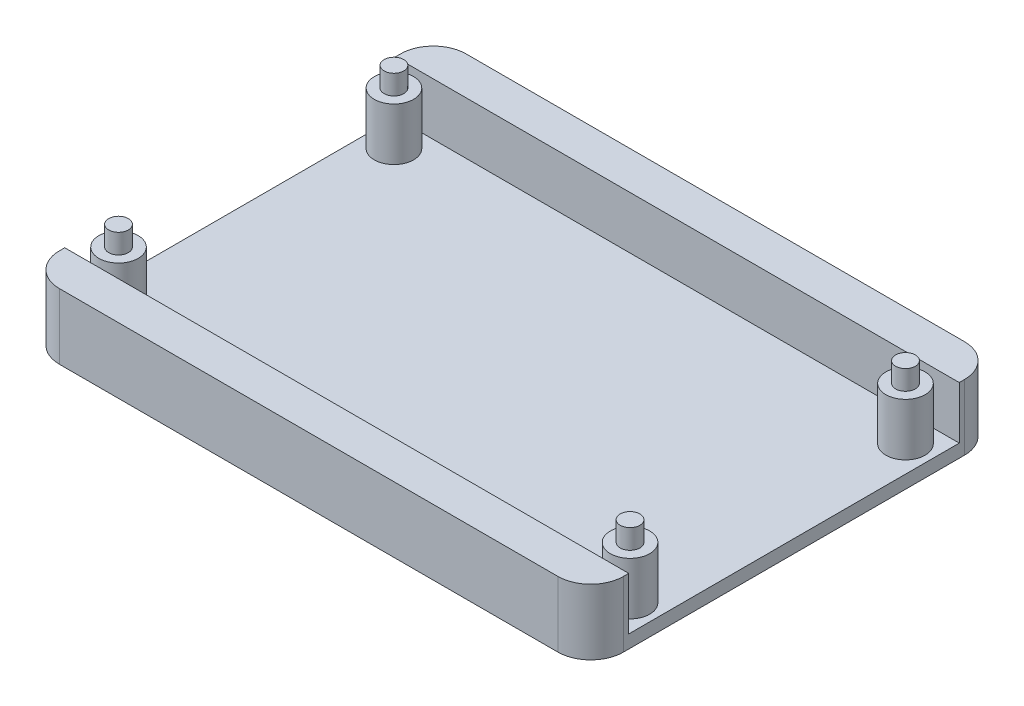
ISO-10303-21;
HEADER;
FILE_DESCRIPTION(('STEP AP214'),'2;1');
FILE_NAME('part.step','',(''),(''),'','','');
FILE_SCHEMA(('AUTOMOTIVE_DESIGN { 1 0 10303 214 1 1 1 1 }'));
ENDSEC;
DATA;
#1=APPLICATION_CONTEXT('core data for automotive mechanical design processes');
#2=APPLICATION_PROTOCOL_DEFINITION('international standard','automotive_design',2000,#1);
#3=PRODUCT_CONTEXT('',#1,'mechanical');
#4=PRODUCT('Part','Part','',(#3));
#5=PRODUCT_RELATED_PRODUCT_CATEGORY('part','',(#4));
#6=PRODUCT_DEFINITION_FORMATION('','',#4);
#7=PRODUCT_DEFINITION_CONTEXT('part definition',#1,'design');
#8=PRODUCT_DEFINITION('design','',#6,#7);
#9=PRODUCT_DEFINITION_SHAPE('','',#8);
#10=(LENGTH_UNIT() NAMED_UNIT(*) SI_UNIT(.MILLI.,.METRE.));
#11=(NAMED_UNIT(*) PLANE_ANGLE_UNIT() SI_UNIT($,.RADIAN.));
#12=(NAMED_UNIT(*) SI_UNIT($,.STERADIAN.) SOLID_ANGLE_UNIT());
#13=UNCERTAINTY_MEASURE_WITH_UNIT(LENGTH_MEASURE(1.E-05),#10,'distance_accuracy_value','');
#14=(GEOMETRIC_REPRESENTATION_CONTEXT(3) GLOBAL_UNCERTAINTY_ASSIGNED_CONTEXT((#13)) GLOBAL_UNIT_ASSIGNED_CONTEXT((#10,
#11,#12)) REPRESENTATION_CONTEXT('',''));
#15=CARTESIAN_POINT('',(0.,0.,0.));
#16=DIRECTION('',(0.,0.,1.));
#17=DIRECTION('',(1.,0.,0.));
#18=AXIS2_PLACEMENT_3D('',#15,#16,#17);
#19=CARTESIAN_POINT('',(0.,10.,0.));
#20=DIRECTION('',(0.,1.,0.));
#21=DIRECTION('',(0.,0.,1.));
#22=AXIS2_PLACEMENT_3D('',#19,#20,#21);
#23=PLANE('',#22);
#24=DIRECTION('',(0.,0.,-1.));
#25=VECTOR('',#24,1.);
#26=CARTESIAN_POINT('',(43.,10.,31.));
#27=LINE('',#26,#25);
#28=CARTESIAN_POINT('',(43.,10.,-25.2));
#29=VERTEX_POINT('',#28);
#30=CARTESIAN_POINT('',(43.,10.,-26.));
#31=VERTEX_POINT('',#30);
#32=EDGE_CURVE('E158',#29,#31,#27,.T.);
#33=ORIENTED_EDGE('',*,*,#32,.T.);
#34=CARTESIAN_POINT('',(38.,10.,-26.));
#35=DIRECTION('',(0.,1.,0.));
#36=DIRECTION('',(0.,0.,1.));
#37=AXIS2_PLACEMENT_3D('',#34,#35,#36);
#38=CIRCLE('',#37,5.);
#39=CARTESIAN_POINT('',(38.,10.,-31.));
#40=VERTEX_POINT('',#39);
#41=EDGE_CURVE('E197',#31,#40,#38,.T.);
#42=ORIENTED_EDGE('',*,*,#41,.T.);
#43=DIRECTION('',(-1.,0.,0.));
#44=VECTOR('',#43,1.);
#45=CARTESIAN_POINT('',(43.,10.,-31.));
#46=LINE('',#45,#44);
#47=CARTESIAN_POINT('',(-38.,10.,-31.));
#48=VERTEX_POINT('',#47);
#49=EDGE_CURVE('E161',#40,#48,#46,.T.);
#50=ORIENTED_EDGE('',*,*,#49,.T.);
#51=CARTESIAN_POINT('',(-38.,10.,-26.));
#52=DIRECTION('',(0.,1.,0.));
#53=DIRECTION('',(0.,0.,1.));
#54=AXIS2_PLACEMENT_3D('',#51,#52,#53);
#55=CIRCLE('',#54,5.);
#56=CARTESIAN_POINT('',(-43.,10.,-26.));
#57=VERTEX_POINT('',#56);
#58=EDGE_CURVE('E195',#48,#57,#55,.T.);
#59=ORIENTED_EDGE('',*,*,#58,.T.);
#60=DIRECTION('',(0.,0.,1.));
#61=VECTOR('',#60,1.);
#62=CARTESIAN_POINT('',(-43.,10.,31.));
#63=LINE('',#62,#61);
#64=CARTESIAN_POINT('',(-43.,10.,-25.2));
#65=VERTEX_POINT('',#64);
#66=EDGE_CURVE('E154',#57,#65,#63,.T.);
#67=ORIENTED_EDGE('',*,*,#66,.T.);
#68=DIRECTION('',(-1.,0.,0.));
#69=VECTOR('',#68,1.);
#70=CARTESIAN_POINT('',(43.,10.,-25.2));
#71=LINE('',#70,#69);
#72=EDGE_CURVE('E144',#29,#65,#71,.T.);
#73=ORIENTED_EDGE('',*,*,#72,.F.);
#74=EDGE_LOOP('',(#33,#42,#50,#59,#67,#73));
#75=FACE_BOUND('',#74,.T.);
#76=ADVANCED_FACE('F34',(#75),#23,.T.);
#77=CARTESIAN_POINT('',(-43.,10.,31.));
#78=DIRECTION('',(1.,0.,0.));
#79=DIRECTION('',(0.,0.,-1.));
#80=AXIS2_PLACEMENT_3D('',#77,#78,#79);
#81=PLANE('',#80);
#82=DIRECTION('',(0.,0.,1.));
#83=VECTOR('',#82,1.);
#84=CARTESIAN_POINT('',(-43.,0.,31.));
#85=LINE('',#84,#83);
#86=CARTESIAN_POINT('',(-43.,0.,-26.));
#87=VERTEX_POINT('',#86);
#88=CARTESIAN_POINT('',(-43.,0.,26.));
#89=VERTEX_POINT('',#88);
#90=EDGE_CURVE('E165',#87,#89,#85,.T.);
#91=ORIENTED_EDGE('',*,*,#90,.T.);
#92=DIRECTION('',(0.,-1.,0.));
#93=VECTOR('',#92,1.);
#94=CARTESIAN_POINT('',(-43.,10.,26.));
#95=LINE('',#94,#93);
#96=CARTESIAN_POINT('',(-43.,10.,26.));
#97=VERTEX_POINT('',#96);
#98=EDGE_CURVE('E11',#89,#97,#95,.F.);
#99=ORIENTED_EDGE('',*,*,#98,.T.);
#100=CARTESIAN_POINT('',(-43.,10.,25.2));
#101=VERTEX_POINT('',#100);
#102=EDGE_CURVE('E147',#101,#97,#63,.T.);
#103=ORIENTED_EDGE('',*,*,#102,.F.);
#104=DIRECTION('',(0.,1.,0.));
#105=VECTOR('',#104,1.);
#106=CARTESIAN_POINT('',(-43.,2.,25.2));
#107=LINE('',#106,#105);
#108=CARTESIAN_POINT('',(-43.,2.,25.2));
#109=VERTEX_POINT('',#108);
#110=EDGE_CURVE('E129',#109,#101,#107,.T.);
#111=ORIENTED_EDGE('',*,*,#110,.F.);
#112=DIRECTION('',(0.,0.,1.));
#113=VECTOR('',#112,1.);
#114=CARTESIAN_POINT('',(-43.,2.,25.2));
#115=LINE('',#114,#113);
#116=CARTESIAN_POINT('',(-43.,2.,-25.2));
#117=VERTEX_POINT('',#116);
#118=EDGE_CURVE('E136',#117,#109,#115,.T.);
#119=ORIENTED_EDGE('',*,*,#118,.F.);
#120=DIRECTION('',(0.,1.,0.));
#121=VECTOR('',#120,1.);
#122=CARTESIAN_POINT('',(-43.,2.,-25.2));
#123=LINE('',#122,#121);
#124=EDGE_CURVE('E168',#117,#65,#123,.T.);
#125=ORIENTED_EDGE('',*,*,#124,.T.);
#126=ORIENTED_EDGE('',*,*,#66,.F.);
#127=DIRECTION('',(0.,-1.,0.));
#128=VECTOR('',#127,1.);
#129=CARTESIAN_POINT('',(-43.,10.,-26.));
#130=LINE('',#129,#128);
#131=EDGE_CURVE('E42',#57,#87,#130,.T.);
#132=ORIENTED_EDGE('',*,*,#131,.T.);
#133=EDGE_LOOP('',(#91,#99,#103,#111,#119,#125,#126,#132));
#134=FACE_BOUND('',#133,.T.);
#135=ADVANCED_FACE('F146',(#134),#81,.F.);
#136=CARTESIAN_POINT('',(43.,10.,31.));
#137=DIRECTION('',(0.,0.,-1.));
#138=DIRECTION('',(-1.,0.,0.));
#139=AXIS2_PLACEMENT_3D('',#136,#137,#138);
#140=PLANE('',#139);
#141=DIRECTION('',(1.,0.,0.));
#142=VECTOR('',#141,1.);
#143=CARTESIAN_POINT('',(43.,0.,31.));
#144=LINE('',#143,#142);
#145=CARTESIAN_POINT('',(-38.,0.,31.));
#146=VERTEX_POINT('',#145);
#147=CARTESIAN_POINT('',(38.,0.,31.));
#148=VERTEX_POINT('',#147);
#149=EDGE_CURVE('E167',#146,#148,#144,.T.);
#150=ORIENTED_EDGE('',*,*,#149,.T.);
#151=DIRECTION('',(0.,-1.,0.));
#152=VECTOR('',#151,1.);
#153=CARTESIAN_POINT('',(38.,10.,31.));
#154=LINE('',#153,#152);
#155=CARTESIAN_POINT('',(38.,10.,31.));
#156=VERTEX_POINT('',#155);
#157=EDGE_CURVE('E55',#148,#156,#154,.F.);
#158=ORIENTED_EDGE('',*,*,#157,.T.);
#159=DIRECTION('',(1.,0.,0.));
#160=VECTOR('',#159,1.);
#161=CARTESIAN_POINT('',(43.,10.,31.));
#162=LINE('',#161,#160);
#163=CARTESIAN_POINT('',(-38.,10.,31.));
#164=VERTEX_POINT('',#163);
#165=EDGE_CURVE('E156',#164,#156,#162,.T.);
#166=ORIENTED_EDGE('',*,*,#165,.F.);
#167=DIRECTION('',(0.,-1.,0.));
#168=VECTOR('',#167,1.);
#169=CARTESIAN_POINT('',(-38.,10.,31.));
#170=LINE('',#169,#168);
#171=EDGE_CURVE('E199',#164,#146,#170,.T.);
#172=ORIENTED_EDGE('',*,*,#171,.T.);
#173=EDGE_LOOP('',(#150,#158,#166,#172));
#174=FACE_BOUND('',#173,.T.);
#175=ADVANCED_FACE('F220',(#174),#140,.F.);
#176=CARTESIAN_POINT('',(43.,10.,31.));
#177=DIRECTION('',(-1.,0.,0.));
#178=DIRECTION('',(0.,0.,1.));
#179=AXIS2_PLACEMENT_3D('',#176,#177,#178);
#180=PLANE('',#179);
#181=DIRECTION('',(0.,0.,-1.));
#182=VECTOR('',#181,1.);
#183=CARTESIAN_POINT('',(43.,0.,31.));
#184=LINE('',#183,#182);
#185=CARTESIAN_POINT('',(43.,0.,26.));
#186=VERTEX_POINT('',#185);
#187=CARTESIAN_POINT('',(43.,0.,-26.));
#188=VERTEX_POINT('',#187);
#189=EDGE_CURVE('E170',#186,#188,#184,.T.);
#190=ORIENTED_EDGE('',*,*,#189,.T.);
#191=DIRECTION('',(0.,-1.,0.));
#192=VECTOR('',#191,1.);
#193=CARTESIAN_POINT('',(43.,10.,-26.));
#194=LINE('',#193,#192);
#195=EDGE_CURVE('E193',#188,#31,#194,.F.);
#196=ORIENTED_EDGE('',*,*,#195,.T.);
#197=ORIENTED_EDGE('',*,*,#32,.F.);
#198=DIRECTION('',(0.,1.,0.));
#199=VECTOR('',#198,1.);
#200=CARTESIAN_POINT('',(43.,2.,-25.2));
#201=LINE('',#200,#199);
#202=CARTESIAN_POINT('',(43.,2.,-25.2));
#203=VERTEX_POINT('',#202);
#204=EDGE_CURVE('E149',#203,#29,#201,.T.);
#205=ORIENTED_EDGE('',*,*,#204,.F.);
#206=DIRECTION('',(0.,0.,-1.));
#207=VECTOR('',#206,1.);
#208=CARTESIAN_POINT('',(43.,2.,25.2));
#209=LINE('',#208,#207);
#210=CARTESIAN_POINT('',(43.,2.,25.2));
#211=VERTEX_POINT('',#210);
#212=EDGE_CURVE('E135',#211,#203,#209,.T.);
#213=ORIENTED_EDGE('',*,*,#212,.F.);
#214=DIRECTION('',(0.,1.,0.));
#215=VECTOR('',#214,1.);
#216=CARTESIAN_POINT('',(43.,2.,25.2));
#217=LINE('',#216,#215);
#218=CARTESIAN_POINT('',(43.,10.,25.2));
#219=VERTEX_POINT('',#218);
#220=EDGE_CURVE('E132',#211,#219,#217,.T.);
#221=ORIENTED_EDGE('',*,*,#220,.T.);
#222=CARTESIAN_POINT('',(43.,10.,26.));
#223=VERTEX_POINT('',#222);
#224=EDGE_CURVE('E159',#223,#219,#27,.T.);
#225=ORIENTED_EDGE('',*,*,#224,.F.);
#226=DIRECTION('',(0.,-1.,0.));
#227=VECTOR('',#226,1.);
#228=CARTESIAN_POINT('',(43.,10.,26.));
#229=LINE('',#228,#227);
#230=EDGE_CURVE('E190',#223,#186,#229,.T.);
#231=ORIENTED_EDGE('',*,*,#230,.T.);
#232=EDGE_LOOP('',(#190,#196,#197,#205,#213,#221,#225,#231));
#233=FACE_BOUND('',#232,.T.);
#234=ADVANCED_FACE('F230',(#233),#180,.F.);
#235=CARTESIAN_POINT('',(43.,10.,-31.));
#236=DIRECTION('',(0.,0.,1.));
#237=DIRECTION('',(1.,0.,0.));
#238=AXIS2_PLACEMENT_3D('',#235,#236,#237);
#239=PLANE('',#238);
#240=ORIENTED_EDGE('',*,*,#49,.F.);
#241=DIRECTION('',(0.,-1.,0.));
#242=VECTOR('',#241,1.);
#243=CARTESIAN_POINT('',(38.,10.,-31.));
#244=LINE('',#243,#242);
#245=CARTESIAN_POINT('',(38.,0.,-31.));
#246=VERTEX_POINT('',#245);
#247=EDGE_CURVE('E178',#40,#246,#244,.T.);
#248=ORIENTED_EDGE('',*,*,#247,.T.);
#249=DIRECTION('',(-1.,0.,0.));
#250=VECTOR('',#249,1.);
#251=CARTESIAN_POINT('',(43.,0.,-31.));
#252=LINE('',#251,#250);
#253=CARTESIAN_POINT('',(-38.,0.,-31.));
#254=VERTEX_POINT('',#253);
#255=EDGE_CURVE('E173',#246,#254,#252,.T.);
#256=ORIENTED_EDGE('',*,*,#255,.T.);
#257=DIRECTION('',(0.,-1.,0.));
#258=VECTOR('',#257,1.);
#259=CARTESIAN_POINT('',(-38.,10.,-31.));
#260=LINE('',#259,#258);
#261=EDGE_CURVE('E176',#254,#48,#260,.F.);
#262=ORIENTED_EDGE('',*,*,#261,.T.);
#263=EDGE_LOOP('',(#240,#248,#256,#262));
#264=FACE_BOUND('',#263,.T.);
#265=ADVANCED_FACE('F238',(#264),#239,.F.);
#266=ORIENTED_EDGE('',*,*,#165,.T.);
#267=CARTESIAN_POINT('',(38.,10.,26.));
#268=DIRECTION('',(0.,1.,0.));
#269=DIRECTION('',(0.,0.,1.));
#270=AXIS2_PLACEMENT_3D('',#267,#268,#269);
#271=CIRCLE('',#270,5.);
#272=EDGE_CURVE('E205',#156,#223,#271,.T.);
#273=ORIENTED_EDGE('',*,*,#272,.T.);
#274=ORIENTED_EDGE('',*,*,#224,.T.);
#275=DIRECTION('',(1.,0.,0.));
#276=VECTOR('',#275,1.);
#277=CARTESIAN_POINT('',(43.,10.,25.2));
#278=LINE('',#277,#276);
#279=EDGE_CURVE('E317',#101,#219,#278,.T.);
#280=ORIENTED_EDGE('',*,*,#279,.F.);
#281=ORIENTED_EDGE('',*,*,#102,.T.);
#282=CARTESIAN_POINT('',(-38.,10.,26.));
#283=DIRECTION('',(0.,1.,0.));
#284=DIRECTION('',(0.,0.,1.));
#285=AXIS2_PLACEMENT_3D('',#282,#283,#284);
#286=CIRCLE('',#285,5.);
#287=EDGE_CURVE('E203',#97,#164,#286,.T.);
#288=ORIENTED_EDGE('',*,*,#287,.T.);
#289=EDGE_LOOP('',(#266,#273,#274,#280,#281,#288));
#290=FACE_BOUND('',#289,.T.);
#291=ADVANCED_FACE('F223',(#290),#23,.T.);
#292=CARTESIAN_POINT('',(0.,0.,0.));
#293=DIRECTION('',(0.,1.,0.));
#294=DIRECTION('',(0.,0.,1.));
#295=AXIS2_PLACEMENT_3D('',#292,#293,#294);
#296=PLANE('',#295);
#297=ORIENTED_EDGE('',*,*,#255,.F.);
#298=CARTESIAN_POINT('',(38.,0.,-26.));
#299=DIRECTION('',(0.,1.,0.));
#300=DIRECTION('',(0.,0.,1.));
#301=AXIS2_PLACEMENT_3D('',#298,#299,#300);
#302=CIRCLE('',#301,5.);
#303=EDGE_CURVE('E188',#246,#188,#302,.F.);
#304=ORIENTED_EDGE('',*,*,#303,.T.);
#305=ORIENTED_EDGE('',*,*,#189,.F.);
#306=CARTESIAN_POINT('',(38.,0.,26.));
#307=DIRECTION('',(0.,1.,0.));
#308=DIRECTION('',(0.,0.,1.));
#309=AXIS2_PLACEMENT_3D('',#306,#307,#308);
#310=CIRCLE('',#309,5.);
#311=EDGE_CURVE('E186',#186,#148,#310,.F.);
#312=ORIENTED_EDGE('',*,*,#311,.T.);
#313=ORIENTED_EDGE('',*,*,#149,.F.);
#314=CARTESIAN_POINT('',(-38.,0.,26.));
#315=DIRECTION('',(0.,1.,0.));
#316=DIRECTION('',(0.,0.,1.));
#317=AXIS2_PLACEMENT_3D('',#314,#315,#316);
#318=CIRCLE('',#317,5.);
#319=EDGE_CURVE('E184',#146,#89,#318,.F.);
#320=ORIENTED_EDGE('',*,*,#319,.T.);
#321=ORIENTED_EDGE('',*,*,#90,.F.);
#322=CARTESIAN_POINT('',(-38.,0.,-26.));
#323=DIRECTION('',(0.,1.,0.));
#324=DIRECTION('',(0.,0.,1.));
#325=AXIS2_PLACEMENT_3D('',#322,#323,#324);
#326=CIRCLE('',#325,5.);
#327=EDGE_CURVE('E182',#87,#254,#326,.F.);
#328=ORIENTED_EDGE('',*,*,#327,.T.);
#329=EDGE_LOOP('',(#297,#304,#305,#312,#313,#320,#321,#328));
#330=FACE_BOUND('',#329,.T.);
#331=ADVANCED_FACE('F214',(#330),#296,.F.);
#332=CARTESIAN_POINT('',(43.,2.,-25.2));
#333=DIRECTION('',(0.,0.,-1.));
#334=DIRECTION('',(-1.,0.,0.));
#335=AXIS2_PLACEMENT_3D('',#332,#333,#334);
#336=PLANE('',#335);
#337=ORIENTED_EDGE('',*,*,#72,.T.);
#338=ORIENTED_EDGE('',*,*,#124,.F.);
#339=DIRECTION('',(-1.,0.,0.));
#340=VECTOR('',#339,1.);
#341=CARTESIAN_POINT('',(43.,2.,-25.2));
#342=LINE('',#341,#340);
#343=EDGE_CURVE('E142',#203,#117,#342,.T.);
#344=ORIENTED_EDGE('',*,*,#343,.F.);
#345=ORIENTED_EDGE('',*,*,#204,.T.);
#346=EDGE_LOOP('',(#337,#338,#344,#345));
#347=FACE_BOUND('',#346,.T.);
#348=ADVANCED_FACE('F264',(#347),#336,.F.);
#349=CARTESIAN_POINT('',(43.,2.,25.2));
#350=DIRECTION('',(0.,0.,1.));
#351=DIRECTION('',(1.,0.,0.));
#352=AXIS2_PLACEMENT_3D('',#349,#350,#351);
#353=PLANE('',#352);
#354=ORIENTED_EDGE('',*,*,#279,.T.);
#355=ORIENTED_EDGE('',*,*,#220,.F.);
#356=DIRECTION('',(1.,0.,0.));
#357=VECTOR('',#356,1.);
#358=CARTESIAN_POINT('',(43.,2.,25.2));
#359=LINE('',#358,#357);
#360=EDGE_CURVE('E124',#109,#211,#359,.T.);
#361=ORIENTED_EDGE('',*,*,#360,.F.);
#362=ORIENTED_EDGE('',*,*,#110,.T.);
#363=EDGE_LOOP('',(#354,#355,#361,#362));
#364=FACE_BOUND('',#363,.T.);
#365=ADVANCED_FACE('F127',(#364),#353,.F.);
#366=CARTESIAN_POINT('',(0.,2.,0.));
#367=DIRECTION('',(0.,1.,0.));
#368=DIRECTION('',(0.,0.,1.));
#369=AXIS2_PLACEMENT_3D('',#366,#367,#368);
#370=PLANE('',#369);
#371=CARTESIAN_POINT('',(-38.9999999999996,2.,21.));
#372=DIRECTION('',(0.,1.,0.));
#373=DIRECTION('',(0.,0.,1.));
#374=AXIS2_PLACEMENT_3D('',#371,#372,#373);
#375=CIRCLE('',#374,3.);
#376=CARTESIAN_POINT('',(-38.9999999999996,2.,24.));
#377=VERTEX_POINT('',#376);
#378=EDGE_CURVE('E298',#377,#377,#375,.T.);
#379=ORIENTED_EDGE('',*,*,#378,.F.);
#380=EDGE_LOOP('',(#379));
#381=FACE_BOUND('',#380,.T.);
#382=CARTESIAN_POINT('',(39.0000000000004,2.,21.));
#383=DIRECTION('',(0.,1.,0.));
#384=DIRECTION('',(0.,0.,1.));
#385=AXIS2_PLACEMENT_3D('',#382,#383,#384);
#386=CIRCLE('',#385,3.);
#387=CARTESIAN_POINT('',(39.0000000000004,2.,24.));
#388=VERTEX_POINT('',#387);
#389=EDGE_CURVE('E297',#388,#388,#386,.T.);
#390=ORIENTED_EDGE('',*,*,#389,.F.);
#391=EDGE_LOOP('',(#390));
#392=FACE_BOUND('',#391,.T.);
#393=CARTESIAN_POINT('',(39.,2.,-21.));
#394=DIRECTION('',(0.,1.,0.));
#395=DIRECTION('',(0.,0.,1.));
#396=AXIS2_PLACEMENT_3D('',#393,#394,#395);
#397=CIRCLE('',#396,3.);
#398=CARTESIAN_POINT('',(39.,2.,-18.));
#399=VERTEX_POINT('',#398);
#400=EDGE_CURVE('E308',#399,#399,#397,.T.);
#401=ORIENTED_EDGE('',*,*,#400,.F.);
#402=EDGE_LOOP('',(#401));
#403=FACE_BOUND('',#402,.T.);
#404=CARTESIAN_POINT('',(-39.,2.,-21.));
#405=DIRECTION('',(0.,1.,0.));
#406=DIRECTION('',(0.,0.,1.));
#407=AXIS2_PLACEMENT_3D('',#404,#405,#406);
#408=CIRCLE('',#407,3.);
#409=CARTESIAN_POINT('',(-39.,2.,-18.));
#410=VERTEX_POINT('',#409);
#411=EDGE_CURVE('E314',#410,#410,#408,.T.);
#412=ORIENTED_EDGE('',*,*,#411,.F.);
#413=EDGE_LOOP('',(#412));
#414=FACE_BOUND('',#413,.T.);
#415=ORIENTED_EDGE('',*,*,#118,.T.);
#416=ORIENTED_EDGE('',*,*,#360,.T.);
#417=ORIENTED_EDGE('',*,*,#212,.T.);
#418=ORIENTED_EDGE('',*,*,#343,.T.);
#419=EDGE_LOOP('',(#415,#416,#417,#418));
#420=FACE_BOUND('',#419,.T.);
#421=ADVANCED_FACE('F140',(#381,#392,#403,#414,#420),#370,.T.);
#422=CARTESIAN_POINT('',(-39.,2.,-21.));
#423=DIRECTION('',(0.,1.,0.));
#424=DIRECTION('',(0.,0.,1.));
#425=AXIS2_PLACEMENT_3D('',#422,#423,#424);
#426=CYLINDRICAL_SURFACE('',#425,3.);
#427=ORIENTED_EDGE('',*,*,#411,.T.);
#428=EDGE_LOOP('',(#427));
#429=FACE_BOUND('',#428,.T.);
#430=CARTESIAN_POINT('',(-39.,10.,-21.));
#431=DIRECTION('',(0.,1.,0.));
#432=DIRECTION('',(0.,0.,1.));
#433=AXIS2_PLACEMENT_3D('',#430,#431,#432);
#434=CIRCLE('',#433,3.);
#435=CARTESIAN_POINT('',(-39.,10.,-18.));
#436=VERTEX_POINT('',#435);
#437=EDGE_CURVE('E311',#436,#436,#434,.T.);
#438=ORIENTED_EDGE('',*,*,#437,.F.);
#439=EDGE_LOOP('',(#438));
#440=FACE_BOUND('',#439,.T.);
#441=ADVANCED_FACE('F336',(#429,#440),#426,.T.);
#442=CARTESIAN_POINT('',(39.,2.,-21.));
#443=DIRECTION('',(0.,1.,0.));
#444=DIRECTION('',(0.,0.,1.));
#445=AXIS2_PLACEMENT_3D('',#442,#443,#444);
#446=CYLINDRICAL_SURFACE('',#445,3.);
#447=ORIENTED_EDGE('',*,*,#400,.T.);
#448=EDGE_LOOP('',(#447));
#449=FACE_BOUND('',#448,.T.);
#450=CARTESIAN_POINT('',(39.,10.,-21.));
#451=DIRECTION('',(0.,1.,0.));
#452=DIRECTION('',(0.,0.,1.));
#453=AXIS2_PLACEMENT_3D('',#450,#451,#452);
#454=CIRCLE('',#453,3.);
#455=CARTESIAN_POINT('',(39.,10.,-18.));
#456=VERTEX_POINT('',#455);
#457=EDGE_CURVE('E301',#456,#456,#454,.T.);
#458=ORIENTED_EDGE('',*,*,#457,.F.);
#459=EDGE_LOOP('',(#458));
#460=FACE_BOUND('',#459,.T.);
#461=ADVANCED_FACE('F340',(#449,#460),#446,.T.);
#462=CARTESIAN_POINT('',(39.0000000000004,2.,21.));
#463=DIRECTION('',(0.,1.,0.));
#464=DIRECTION('',(0.,0.,1.));
#465=AXIS2_PLACEMENT_3D('',#462,#463,#464);
#466=CYLINDRICAL_SURFACE('',#465,3.);
#467=ORIENTED_EDGE('',*,*,#389,.T.);
#468=EDGE_LOOP('',(#467));
#469=FACE_BOUND('',#468,.T.);
#470=CARTESIAN_POINT('',(39.0000000000004,10.,21.));
#471=DIRECTION('',(0.,1.,0.));
#472=DIRECTION('',(0.,0.,1.));
#473=AXIS2_PLACEMENT_3D('',#470,#471,#472);
#474=CIRCLE('',#473,3.);
#475=CARTESIAN_POINT('',(39.0000000000004,10.,24.));
#476=VERTEX_POINT('',#475);
#477=EDGE_CURVE('E295',#476,#476,#474,.T.);
#478=ORIENTED_EDGE('',*,*,#477,.F.);
#479=EDGE_LOOP('',(#478));
#480=FACE_BOUND('',#479,.T.);
#481=ADVANCED_FACE('F286',(#469,#480),#466,.T.);
#482=CARTESIAN_POINT('',(-38.9999999999996,2.,21.));
#483=DIRECTION('',(0.,1.,0.));
#484=DIRECTION('',(0.,0.,1.));
#485=AXIS2_PLACEMENT_3D('',#482,#483,#484);
#486=CYLINDRICAL_SURFACE('',#485,3.);
#487=ORIENTED_EDGE('',*,*,#378,.T.);
#488=EDGE_LOOP('',(#487));
#489=FACE_BOUND('',#488,.T.);
#490=CARTESIAN_POINT('',(-38.9999999999996,10.,21.));
#491=DIRECTION('',(0.,1.,0.));
#492=DIRECTION('',(0.,0.,1.));
#493=AXIS2_PLACEMENT_3D('',#490,#491,#492);
#494=CIRCLE('',#493,3.);
#495=CARTESIAN_POINT('',(-38.9999999999996,10.,24.));
#496=VERTEX_POINT('',#495);
#497=EDGE_CURVE('E304',#496,#496,#494,.T.);
#498=ORIENTED_EDGE('',*,*,#497,.F.);
#499=EDGE_LOOP('',(#498));
#500=FACE_BOUND('',#499,.T.);
#501=ADVANCED_FACE('F279',(#489,#500),#486,.T.);
#502=CARTESIAN_POINT('',(39.0000000000004,10.,21.));
#503=DIRECTION('',(0.,1.,0.));
#504=DIRECTION('',(0.,0.,1.));
#505=AXIS2_PLACEMENT_3D('',#502,#503,#504);
#506=CIRCLE('',#505,1.5);
#507=CARTESIAN_POINT('',(39.0000000000004,10.,22.5));
#508=VERTEX_POINT('',#507);
#509=EDGE_CURVE('E292',#508,#508,#506,.T.);
#510=ORIENTED_EDGE('',*,*,#509,.F.);
#511=EDGE_LOOP('',(#510));
#512=FACE_BOUND('',#511,.T.);
#513=ORIENTED_EDGE('',*,*,#477,.T.);
#514=EDGE_LOOP('',(#513));
#515=FACE_BOUND('',#514,.T.);
#516=ADVANCED_FACE('F269',(#512,#515),#23,.T.);
#517=CARTESIAN_POINT('',(39.,10.,-21.));
#518=DIRECTION('',(0.,1.,0.));
#519=DIRECTION('',(0.,0.,1.));
#520=AXIS2_PLACEMENT_3D('',#517,#518,#519);
#521=CIRCLE('',#520,1.5);
#522=CARTESIAN_POINT('',(39.,10.,-19.5));
#523=VERTEX_POINT('',#522);
#524=EDGE_CURVE('E390',#523,#523,#521,.T.);
#525=ORIENTED_EDGE('',*,*,#524,.F.);
#526=EDGE_LOOP('',(#525));
#527=FACE_BOUND('',#526,.T.);
#528=ORIENTED_EDGE('',*,*,#457,.T.);
#529=EDGE_LOOP('',(#528));
#530=FACE_BOUND('',#529,.T.);
#531=ADVANCED_FACE('F257',(#527,#530),#23,.T.);
#532=CARTESIAN_POINT('',(-39.,10.,-21.));
#533=DIRECTION('',(0.,1.,0.));
#534=DIRECTION('',(0.,0.,1.));
#535=AXIS2_PLACEMENT_3D('',#532,#533,#534);
#536=CIRCLE('',#535,1.5);
#537=CARTESIAN_POINT('',(-39.,10.,-19.5));
#538=VERTEX_POINT('',#537);
#539=EDGE_CURVE('E164',#538,#538,#536,.T.);
#540=ORIENTED_EDGE('',*,*,#539,.F.);
#541=EDGE_LOOP('',(#540));
#542=FACE_BOUND('',#541,.T.);
#543=ORIENTED_EDGE('',*,*,#437,.T.);
#544=EDGE_LOOP('',(#543));
#545=FACE_BOUND('',#544,.T.);
#546=ADVANCED_FACE('F248',(#542,#545),#23,.T.);
#547=CARTESIAN_POINT('',(-38.9999999999996,10.,21.));
#548=DIRECTION('',(0.,1.,0.));
#549=DIRECTION('',(0.,0.,1.));
#550=AXIS2_PLACEMENT_3D('',#547,#548,#549);
#551=CIRCLE('',#550,1.5);
#552=CARTESIAN_POINT('',(-38.9999999999996,10.,22.5));
#553=VERTEX_POINT('',#552);
#554=EDGE_CURVE('E179',#553,#553,#551,.T.);
#555=ORIENTED_EDGE('',*,*,#554,.F.);
#556=EDGE_LOOP('',(#555));
#557=FACE_BOUND('',#556,.T.);
#558=ORIENTED_EDGE('',*,*,#497,.T.);
#559=EDGE_LOOP('',(#558));
#560=FACE_BOUND('',#559,.T.);
#561=ADVANCED_FACE('F256',(#557,#560),#23,.T.);
#562=CARTESIAN_POINT('',(-39.,13.,-21.));
#563=DIRECTION('',(0.,-1.,0.));
#564=DIRECTION('',(0.,0.,-1.));
#565=AXIS2_PLACEMENT_3D('',#562,#563,#564);
#566=CYLINDRICAL_SURFACE('',#565,1.5);
#567=CARTESIAN_POINT('',(-39.,13.,-21.));
#568=DIRECTION('',(0.,1.,0.));
#569=DIRECTION('',(0.,0.,1.));
#570=AXIS2_PLACEMENT_3D('',#567,#568,#569);
#571=CIRCLE('',#570,1.5);
#572=CARTESIAN_POINT('',(-39.,13.,-19.5));
#573=VERTEX_POINT('',#572);
#574=EDGE_CURVE('E393',#573,#573,#571,.T.);
#575=ORIENTED_EDGE('',*,*,#574,.F.);
#576=EDGE_LOOP('',(#575));
#577=FACE_BOUND('',#576,.T.);
#578=ORIENTED_EDGE('',*,*,#539,.T.);
#579=EDGE_LOOP('',(#578));
#580=FACE_BOUND('',#579,.T.);
#581=ADVANCED_FACE('F267',(#577,#580),#566,.T.);
#582=CARTESIAN_POINT('',(-39.,13.,-21.));
#583=DIRECTION('',(0.,1.,0.));
#584=DIRECTION('',(0.,0.,1.));
#585=AXIS2_PLACEMENT_3D('',#582,#583,#584);
#586=PLANE('',#585);
#587=ORIENTED_EDGE('',*,*,#574,.T.);
#588=EDGE_LOOP('',(#587));
#589=FACE_BOUND('',#588,.T.);
#590=ADVANCED_FACE('F273',(#589),#586,.T.);
#591=CARTESIAN_POINT('',(39.,13.,-21.));
#592=DIRECTION('',(0.,-1.,0.));
#593=DIRECTION('',(0.,0.,-1.));
#594=AXIS2_PLACEMENT_3D('',#591,#592,#593);
#595=CYLINDRICAL_SURFACE('',#594,1.5);
#596=CARTESIAN_POINT('',(39.,13.,-21.));
#597=DIRECTION('',(0.,1.,0.));
#598=DIRECTION('',(0.,0.,1.));
#599=AXIS2_PLACEMENT_3D('',#596,#597,#598);
#600=CIRCLE('',#599,1.5);
#601=CARTESIAN_POINT('',(39.,13.,-19.5));
#602=VERTEX_POINT('',#601);
#603=EDGE_CURVE('E384',#602,#602,#600,.T.);
#604=ORIENTED_EDGE('',*,*,#603,.F.);
#605=EDGE_LOOP('',(#604));
#606=FACE_BOUND('',#605,.T.);
#607=ORIENTED_EDGE('',*,*,#524,.T.);
#608=EDGE_LOOP('',(#607));
#609=FACE_BOUND('',#608,.T.);
#610=ADVANCED_FACE('F350',(#606,#609),#595,.T.);
#611=CARTESIAN_POINT('',(39.,13.,-21.));
#612=DIRECTION('',(0.,1.,0.));
#613=DIRECTION('',(0.,0.,1.));
#614=AXIS2_PLACEMENT_3D('',#611,#612,#613);
#615=PLANE('',#614);
#616=ORIENTED_EDGE('',*,*,#603,.T.);
#617=EDGE_LOOP('',(#616));
#618=FACE_BOUND('',#617,.T.);
#619=ADVANCED_FACE('F354',(#618),#615,.T.);
#620=CARTESIAN_POINT('',(39.0000000000004,13.,21.));
#621=DIRECTION('',(0.,-1.,0.));
#622=DIRECTION('',(0.,0.,-1.));
#623=AXIS2_PLACEMENT_3D('',#620,#621,#622);
#624=CYLINDRICAL_SURFACE('',#623,1.5);
#625=CARTESIAN_POINT('',(39.0000000000004,13.,21.));
#626=DIRECTION('',(0.,1.,0.));
#627=DIRECTION('',(0.,0.,1.));
#628=AXIS2_PLACEMENT_3D('',#625,#626,#627);
#629=CIRCLE('',#628,1.5);
#630=CARTESIAN_POINT('',(39.0000000000004,13.,22.5));
#631=VERTEX_POINT('',#630);
#632=EDGE_CURVE('E381',#631,#631,#629,.T.);
#633=ORIENTED_EDGE('',*,*,#632,.F.);
#634=EDGE_LOOP('',(#633));
#635=FACE_BOUND('',#634,.T.);
#636=ORIENTED_EDGE('',*,*,#509,.T.);
#637=EDGE_LOOP('',(#636));
#638=FACE_BOUND('',#637,.T.);
#639=ADVANCED_FACE('F358',(#635,#638),#624,.T.);
#640=CARTESIAN_POINT('',(39.0000000000004,13.,21.));
#641=DIRECTION('',(0.,1.,0.));
#642=DIRECTION('',(0.,0.,1.));
#643=AXIS2_PLACEMENT_3D('',#640,#641,#642);
#644=PLANE('',#643);
#645=ORIENTED_EDGE('',*,*,#632,.T.);
#646=EDGE_LOOP('',(#645));
#647=FACE_BOUND('',#646,.T.);
#648=ADVANCED_FACE('F362',(#647),#644,.T.);
#649=CARTESIAN_POINT('',(-38.9999999999996,13.,21.));
#650=DIRECTION('',(0.,-1.,0.));
#651=DIRECTION('',(0.,0.,-1.));
#652=AXIS2_PLACEMENT_3D('',#649,#650,#651);
#653=CYLINDRICAL_SURFACE('',#652,1.5);
#654=CARTESIAN_POINT('',(-38.9999999999996,13.,21.));
#655=DIRECTION('',(0.,1.,0.));
#656=DIRECTION('',(0.,0.,1.));
#657=AXIS2_PLACEMENT_3D('',#654,#655,#656);
#658=CIRCLE('',#657,1.5);
#659=CARTESIAN_POINT('',(-38.9999999999996,13.,22.5));
#660=VERTEX_POINT('',#659);
#661=EDGE_CURVE('E380',#660,#660,#658,.T.);
#662=ORIENTED_EDGE('',*,*,#661,.F.);
#663=EDGE_LOOP('',(#662));
#664=FACE_BOUND('',#663,.T.);
#665=ORIENTED_EDGE('',*,*,#554,.T.);
#666=EDGE_LOOP('',(#665));
#667=FACE_BOUND('',#666,.T.);
#668=ADVANCED_FACE('F366',(#664,#667),#653,.T.);
#669=CARTESIAN_POINT('',(-38.9999999999996,13.,21.));
#670=DIRECTION('',(0.,1.,0.));
#671=DIRECTION('',(0.,0.,1.));
#672=AXIS2_PLACEMENT_3D('',#669,#670,#671);
#673=PLANE('',#672);
#674=ORIENTED_EDGE('',*,*,#661,.T.);
#675=EDGE_LOOP('',(#674));
#676=FACE_BOUND('',#675,.T.);
#677=ADVANCED_FACE('F370',(#676),#673,.T.);
#678=CARTESIAN_POINT('',(38.,10.,-26.));
#679=DIRECTION('',(0.,-1.,0.));
#680=DIRECTION('',(0.,0.,-1.));
#681=AXIS2_PLACEMENT_3D('',#678,#679,#680);
#682=CYLINDRICAL_SURFACE('',#681,5.);
#683=ORIENTED_EDGE('',*,*,#41,.F.);
#684=ORIENTED_EDGE('',*,*,#195,.F.);
#685=ORIENTED_EDGE('',*,*,#303,.F.);
#686=ORIENTED_EDGE('',*,*,#247,.F.);
#687=EDGE_LOOP('',(#683,#684,#685,#686));
#688=FACE_BOUND('',#687,.T.);
#689=ADVANCED_FACE('F235',(#688),#682,.T.);
#690=CARTESIAN_POINT('',(38.,10.,26.));
#691=DIRECTION('',(0.,-1.,0.));
#692=DIRECTION('',(0.,0.,-1.));
#693=AXIS2_PLACEMENT_3D('',#690,#691,#692);
#694=CYLINDRICAL_SURFACE('',#693,5.);
#695=ORIENTED_EDGE('',*,*,#272,.F.);
#696=ORIENTED_EDGE('',*,*,#157,.F.);
#697=ORIENTED_EDGE('',*,*,#311,.F.);
#698=ORIENTED_EDGE('',*,*,#230,.F.);
#699=EDGE_LOOP('',(#695,#696,#697,#698));
#700=FACE_BOUND('',#699,.T.);
#701=ADVANCED_FACE('F227',(#700),#694,.T.);
#702=CARTESIAN_POINT('',(-38.,10.,26.));
#703=DIRECTION('',(0.,-1.,0.));
#704=DIRECTION('',(0.,0.,-1.));
#705=AXIS2_PLACEMENT_3D('',#702,#703,#704);
#706=CYLINDRICAL_SURFACE('',#705,5.);
#707=ORIENTED_EDGE('',*,*,#287,.F.);
#708=ORIENTED_EDGE('',*,*,#98,.F.);
#709=ORIENTED_EDGE('',*,*,#319,.F.);
#710=ORIENTED_EDGE('',*,*,#171,.F.);
#711=EDGE_LOOP('',(#707,#708,#709,#710));
#712=FACE_BOUND('',#711,.T.);
#713=ADVANCED_FACE('F219',(#712),#706,.T.);
#714=CARTESIAN_POINT('',(-38.,10.,-26.));
#715=DIRECTION('',(0.,-1.,0.));
#716=DIRECTION('',(0.,0.,-1.));
#717=AXIS2_PLACEMENT_3D('',#714,#715,#716);
#718=CYLINDRICAL_SURFACE('',#717,5.);
#719=ORIENTED_EDGE('',*,*,#58,.F.);
#720=ORIENTED_EDGE('',*,*,#261,.F.);
#721=ORIENTED_EDGE('',*,*,#327,.F.);
#722=ORIENTED_EDGE('',*,*,#131,.F.);
#723=EDGE_LOOP('',(#719,#720,#721,#722));
#724=FACE_BOUND('',#723,.T.);
#725=ADVANCED_FACE('F36',(#724),#718,.T.);
#726=CLOSED_SHELL('',(#76,#135,#175,#234,#265,#291,#331,#348,#365,#421,#441,#461,#481,#501,#516,
#531,#546,#561,#581,#590,#610,#619,#639,#648,#668,#677,#689,#701,#713,#725));
#727=MANIFOLD_SOLID_BREP('B2',#726);
#728=ADVANCED_BREP_SHAPE_REPRESENTATION('',(#18,#727),#14);
#729=SHAPE_DEFINITION_REPRESENTATION(#9,#728);
ENDSEC;
END-ISO-10303-21;
